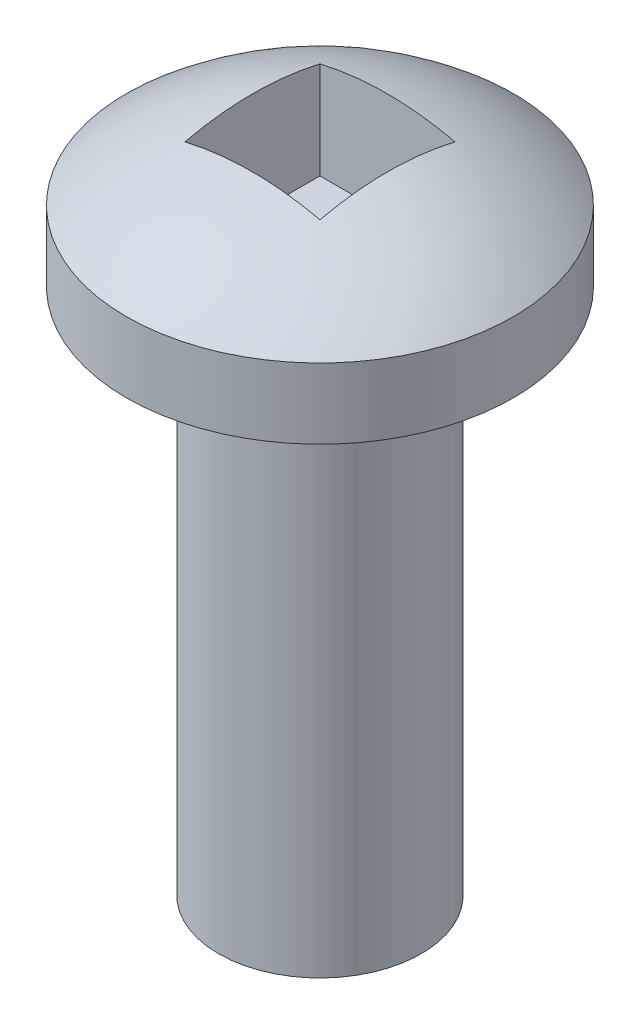
ISO-10303-21;
HEADER;
FILE_DESCRIPTION(('STEP AP214'),'2;1');
FILE_NAME('part.step','',(''),(''),'','','');
FILE_SCHEMA(('AUTOMOTIVE_DESIGN { 1 0 10303 214 1 1 1 1 }'));
ENDSEC;
DATA;
#1=APPLICATION_CONTEXT('core data for automotive mechanical design processes');
#2=APPLICATION_PROTOCOL_DEFINITION('international standard','automotive_design',2000,#1);
#3=PRODUCT_CONTEXT('',#1,'mechanical');
#4=PRODUCT('Part','Part','',(#3));
#5=PRODUCT_RELATED_PRODUCT_CATEGORY('part','',(#4));
#6=PRODUCT_DEFINITION_FORMATION('','',#4);
#7=PRODUCT_DEFINITION_CONTEXT('part definition',#1,'design');
#8=PRODUCT_DEFINITION('design','',#6,#7);
#9=PRODUCT_DEFINITION_SHAPE('','',#8);
#10=(LENGTH_UNIT() NAMED_UNIT(*) SI_UNIT(.MILLI.,.METRE.));
#11=(NAMED_UNIT(*) PLANE_ANGLE_UNIT() SI_UNIT($,.RADIAN.));
#12=(NAMED_UNIT(*) SI_UNIT($,.STERADIAN.) SOLID_ANGLE_UNIT());
#13=UNCERTAINTY_MEASURE_WITH_UNIT(LENGTH_MEASURE(1.E-05),#10,'distance_accuracy_value','');
#14=(GEOMETRIC_REPRESENTATION_CONTEXT(3) GLOBAL_UNCERTAINTY_ASSIGNED_CONTEXT((#13)) GLOBAL_UNIT_ASSIGNED_CONTEXT((#10,
#11,#12)) REPRESENTATION_CONTEXT('',''));
#15=CARTESIAN_POINT('',(0.,0.,0.));
#16=DIRECTION('',(0.,0.,1.));
#17=DIRECTION('',(1.,0.,0.));
#18=AXIS2_PLACEMENT_3D('',#15,#16,#17);
#19=CARTESIAN_POINT('',(0.,-9.525,0.));
#20=DIRECTION('',(0.,1.,0.));
#21=DIRECTION('',(0.,0.,1.));
#22=AXIS2_PLACEMENT_3D('',#19,#20,#21);
#23=CYLINDRICAL_SURFACE('',#22,1.8288);
#24=CARTESIAN_POINT('',(0.,-9.525,0.));
#25=DIRECTION('',(0.,1.,0.));
#26=DIRECTION('',(0.,0.,1.));
#27=AXIS2_PLACEMENT_3D('',#24,#25,#26);
#28=CIRCLE('',#27,1.8288);
#29=CARTESIAN_POINT('',(0.,-9.525,1.8288));
#30=VERTEX_POINT('',#29);
#31=EDGE_CURVE('E104',#30,#30,#28,.T.);
#32=CARTESIAN_POINT('',(0.,0.,0.));
#33=DIRECTION('',(0.,1.,0.));
#34=DIRECTION('',(0.,0.,1.));
#35=AXIS2_PLACEMENT_3D('',#32,#33,#34);
#36=CIRCLE('',#35,1.8288);
#37=CARTESIAN_POINT('',(0.,0.,1.8288));
#38=VERTEX_POINT('',#37);
#39=EDGE_CURVE('E108',#38,#38,#36,.T.);
#40=CARTESIAN_POINT('',(0.,-9.525,1.8288));
#41=CARTESIAN_POINT('',(0.,-9.42578125,1.8288));
#42=CARTESIAN_POINT('',(0.,-9.3265625,1.8288));
#43=CARTESIAN_POINT('',(0.,-9.128125,1.8288));
#44=CARTESIAN_POINT('',(0.,-9.02890625,1.8288));
#45=CARTESIAN_POINT('',(0.,-8.83046875,1.8288));
#46=CARTESIAN_POINT('',(0.,-8.73125,1.8288));
#47=CARTESIAN_POINT('',(0.,-8.5328125,1.8288));
#48=CARTESIAN_POINT('',(0.,-8.43359375,1.8288));
#49=CARTESIAN_POINT('',(0.,-8.23515625,1.8288));
#50=CARTESIAN_POINT('',(0.,-8.1359375,1.8288));
#51=CARTESIAN_POINT('',(0.,-7.9375,1.8288));
#52=CARTESIAN_POINT('',(0.,-7.83828125,1.8288));
#53=CARTESIAN_POINT('',(0.,-7.63984375,1.8288));
#54=CARTESIAN_POINT('',(0.,-7.540625,1.8288));
#55=CARTESIAN_POINT('',(0.,-7.3421875,1.8288));
#56=CARTESIAN_POINT('',(0.,-7.24296875,1.8288));
#57=CARTESIAN_POINT('',(0.,-7.04453125,1.8288));
#58=CARTESIAN_POINT('',(0.,-6.9453125,1.8288));
#59=CARTESIAN_POINT('',(0.,-6.746875,1.8288));
#60=CARTESIAN_POINT('',(0.,-6.64765625,1.8288));
#61=CARTESIAN_POINT('',(0.,-6.44921875,1.8288));
#62=CARTESIAN_POINT('',(0.,-6.35,1.8288));
#63=CARTESIAN_POINT('',(0.,-6.1515625,1.8288));
#64=CARTESIAN_POINT('',(0.,-6.05234375,1.8288));
#65=CARTESIAN_POINT('',(0.,-5.85390625,1.8288));
#66=CARTESIAN_POINT('',(0.,-5.7546875,1.8288));
#67=CARTESIAN_POINT('',(0.,-5.55625,1.8288));
#68=CARTESIAN_POINT('',(0.,-5.45703125,1.8288));
#69=CARTESIAN_POINT('',(0.,-5.25859375,1.8288));
#70=CARTESIAN_POINT('',(0.,-5.159375,1.8288));
#71=CARTESIAN_POINT('',(0.,-4.9609375,1.8288));
#72=CARTESIAN_POINT('',(0.,-4.86171875,1.8288));
#73=CARTESIAN_POINT('',(0.,-4.66328125,1.8288));
#74=CARTESIAN_POINT('',(0.,-4.5640625,1.8288));
#75=CARTESIAN_POINT('',(0.,-4.365625,1.8288));
#76=CARTESIAN_POINT('',(0.,-4.26640625,1.8288));
#77=CARTESIAN_POINT('',(0.,-4.06796875,1.8288));
#78=CARTESIAN_POINT('',(0.,-3.96875,1.8288));
#79=CARTESIAN_POINT('',(0.,-3.7703125,1.8288));
#80=CARTESIAN_POINT('',(0.,-3.67109375,1.8288));
#81=CARTESIAN_POINT('',(0.,-3.47265625,1.8288));
#82=CARTESIAN_POINT('',(0.,-3.3734375,1.8288));
#83=CARTESIAN_POINT('',(0.,-3.175,1.8288));
#84=CARTESIAN_POINT('',(0.,-3.07578125,1.8288));
#85=CARTESIAN_POINT('',(0.,-2.87734375,1.8288));
#86=CARTESIAN_POINT('',(0.,-2.778125,1.8288));
#87=CARTESIAN_POINT('',(0.,-2.5796875,1.8288));
#88=CARTESIAN_POINT('',(0.,-2.48046875,1.8288));
#89=CARTESIAN_POINT('',(0.,-2.28203125,1.8288));
#90=CARTESIAN_POINT('',(0.,-2.1828125,1.8288));
#91=CARTESIAN_POINT('',(0.,-1.984375,1.8288));
#92=CARTESIAN_POINT('',(0.,-1.88515625,1.8288));
#93=CARTESIAN_POINT('',(0.,-1.68671875,1.8288));
#94=CARTESIAN_POINT('',(0.,-1.5875,1.8288));
#95=CARTESIAN_POINT('',(0.,-1.3890625,1.8288));
#96=CARTESIAN_POINT('',(0.,-1.28984375,1.8288));
#97=CARTESIAN_POINT('',(0.,-1.09140625,1.8288));
#98=CARTESIAN_POINT('',(0.,-0.992187500000001,1.8288));
#99=CARTESIAN_POINT('',(0.,-0.793750000000001,1.8288));
#100=CARTESIAN_POINT('',(0.,-0.69453125,1.8288));
#101=CARTESIAN_POINT('',(0.,-0.49609375,1.8288));
#102=CARTESIAN_POINT('',(0.,-0.396875,1.8288));
#103=CARTESIAN_POINT('',(0.,-0.1984375,1.8288));
#104=CARTESIAN_POINT('',(0.,-0.0992187500000001,1.8288));
#105=CARTESIAN_POINT('',(0.,0.,1.8288));
#106=B_SPLINE_CURVE_WITH_KNOTS('',3,(#40,#41,#42,#43,#44,#45,#46,#47,#48,#49,#50,#51,#52,#53,
#54,#55,#56,#57,#58,#59,#60,#61,#62,#63,#64,#65,#66,#67,#68,#69,#70,#71,#72,#73,#74,#75,#76,#77,
#78,#79,#80,#81,#82,#83,#84,#85,#86,#87,#88,#89,#90,#91,#92,#93,#94,#95,#96,#97,#98,#99,#100,
#101,#102,#103,#104,#105),.UNSPECIFIED.,.F.,.F.,(4,2,2,2,2,2,2,2,2,2,2,2,2,2,2,2,2,2,2,2,2,2,2,
2,2,2,2,2,2,2,2,2,4),(0.,0.29765625,0.5953125,0.892968750000001,1.190625,1.48828125,1.7859375,
2.08359375,2.38125,2.67890625,2.9765625,3.27421875,3.571875,3.86953125,4.1671875,4.46484375,
4.7625,5.06015625,5.3578125,5.65546875,5.953125,6.25078125,6.5484375,6.84609375,7.14375,
7.44140625,7.7390625,8.03671875,8.334375,8.63203125,8.9296875,9.22734375,9.525),.UNSPECIFIED.);
#107=EDGE_CURVE('BSEAM32',#30,#38,#106,.T.);
#108=ORIENTED_EDGE('',*,*,#31,.T.);
#109=ORIENTED_EDGE('',*,*,#39,.F.);
#110=ORIENTED_EDGE('',*,*,#107,.T.);
#111=ORIENTED_EDGE('',*,*,#107,.F.);
#112=EDGE_LOOP('',(#108,#110,#109,#111));
#113=FACE_BOUND('',#112,.T.);
#114=ADVANCED_FACE('F32',(#113),#23,.T.);
#115=CARTESIAN_POINT('',(0.,-9.525,0.));
#116=DIRECTION('',(0.,1.,0.));
#117=DIRECTION('',(0.,0.,1.));
#118=AXIS2_PLACEMENT_3D('',#115,#116,#117);
#119=PLANE('',#118);
#120=ORIENTED_EDGE('',*,*,#31,.F.);
#121=EDGE_LOOP('',(#120));
#122=FACE_BOUND('',#121,.T.);
#123=ADVANCED_FACE('F128',(#122),#119,.F.);
#124=CARTESIAN_POINT('',(0.,1.27,0.));
#125=DIRECTION('',(0.,-1.,0.));
#126=DIRECTION('',(0.,0.,-1.));
#127=AXIS2_PLACEMENT_3D('',#124,#125,#126);
#128=CYLINDRICAL_SURFACE('',#127,3.4925);
#129=CARTESIAN_POINT('',(0.,1.27,0.));
#130=DIRECTION('',(0.,1.,0.));
#131=DIRECTION('',(0.,0.,1.));
#132=AXIS2_PLACEMENT_3D('',#129,#130,#131);
#133=CIRCLE('',#132,3.4925);
#134=CARTESIAN_POINT('',(0.,1.27,3.4925));
#135=VERTEX_POINT('',#134);
#136=EDGE_CURVE('E103',#135,#135,#133,.T.);
#137=ORIENTED_EDGE('',*,*,#136,.F.);
#138=EDGE_LOOP('',(#137));
#139=FACE_BOUND('',#138,.T.);
#140=CARTESIAN_POINT('',(0.,0.,0.));
#141=DIRECTION('',(0.,1.,0.));
#142=DIRECTION('',(0.,0.,1.));
#143=AXIS2_PLACEMENT_3D('',#140,#141,#142);
#144=CIRCLE('',#143,3.4925);
#145=CARTESIAN_POINT('',(0.,0.,3.4925));
#146=VERTEX_POINT('',#145);
#147=EDGE_CURVE('E97',#146,#146,#144,.T.);
#148=ORIENTED_EDGE('',*,*,#147,.T.);
#149=EDGE_LOOP('',(#148));
#150=FACE_BOUND('',#149,.T.);
#151=ADVANCED_FACE('F123',(#139,#150),#128,.T.);
#152=CARTESIAN_POINT('',(0.,-2.8971875,0.));
#153=DIRECTION('',(0.,0.,1.));
#154=DIRECTION('',(1.,0.,0.));
#155=AXIS2_PLACEMENT_3D('',#152,#153,#154);
#156=SPHERICAL_SURFACE('',#155,5.4371875);
#157=CARTESIAN_POINT('',(1.2192,-2.8971875,0.));
#158=DIRECTION('',(1.,0.,0.));
#159=DIRECTION('',(0.,0.,-1.));
#160=AXIS2_PLACEMENT_3D('',#157,#158,#159);
#161=CIRCLE('',#160,5.29873185490229);
#162=CARTESIAN_POINT('',(1.2192,2.25937246088053,1.2192));
#163=VERTEX_POINT('',#162);
#164=CARTESIAN_POINT('',(1.2192,2.25937246088053,-1.2192));
#165=VERTEX_POINT('',#164);
#166=EDGE_CURVE('E11',#163,#165,#161,.F.);
#167=ORIENTED_EDGE('',*,*,#166,.F.);
#168=CARTESIAN_POINT('',(0.,-2.8971875,1.2192));
#169=DIRECTION('',(0.,0.,1.));
#170=DIRECTION('',(1.,0.,0.));
#171=AXIS2_PLACEMENT_3D('',#168,#169,#170);
#172=CIRCLE('',#171,5.29873185490229);
#173=CARTESIAN_POINT('',(-1.2192,2.25937246088053,1.2192));
#174=VERTEX_POINT('',#173);
#175=EDGE_CURVE('E40',#174,#163,#172,.F.);
#176=ORIENTED_EDGE('',*,*,#175,.F.);
#177=CARTESIAN_POINT('',(-1.2192,-2.8971875,0.));
#178=DIRECTION('',(-1.,0.,0.));
#179=DIRECTION('',(0.,0.,1.));
#180=AXIS2_PLACEMENT_3D('',#177,#178,#179);
#181=CIRCLE('',#180,5.29873185490229);
#182=CARTESIAN_POINT('',(-1.2192,2.25937246088053,-1.2192));
#183=VERTEX_POINT('',#182);
#184=EDGE_CURVE('E114',#183,#174,#181,.F.);
#185=ORIENTED_EDGE('',*,*,#184,.F.);
#186=CARTESIAN_POINT('',(0.,-2.8971875,-1.2192));
#187=DIRECTION('',(0.,0.,-1.));
#188=DIRECTION('',(-1.,0.,0.));
#189=AXIS2_PLACEMENT_3D('',#186,#187,#188);
#190=CIRCLE('',#189,5.29873185490229);
#191=EDGE_CURVE('E107',#165,#183,#190,.F.);
#192=ORIENTED_EDGE('',*,*,#191,.F.);
#193=EDGE_LOOP('',(#167,#176,#185,#192));
#194=FACE_BOUND('',#193,.T.);
#195=ORIENTED_EDGE('',*,*,#136,.T.);
#196=EDGE_LOOP('',(#195));
#197=FACE_BOUND('',#196,.T.);
#198=ADVANCED_FACE('F34',(#194,#197),#156,.T.);
#199=CARTESIAN_POINT('',(0.,0.,0.));
#200=DIRECTION('',(0.,1.,0.));
#201=DIRECTION('',(0.,0.,1.));
#202=AXIS2_PLACEMENT_3D('',#199,#200,#201);
#203=PLANE('',#202);
#204=ORIENTED_EDGE('',*,*,#39,.T.);
#205=EDGE_LOOP('',(#204));
#206=FACE_BOUND('',#205,.T.);
#207=ORIENTED_EDGE('',*,*,#147,.F.);
#208=EDGE_LOOP('',(#207));
#209=FACE_BOUND('',#208,.T.);
#210=ADVANCED_FACE('F122',(#206,#209),#203,.F.);
#211=CARTESIAN_POINT('',(1.2192,0.508,1.2192));
#212=DIRECTION('',(1.,0.,0.));
#213=DIRECTION('',(0.,0.,-1.));
#214=AXIS2_PLACEMENT_3D('',#211,#212,#213);
#215=PLANE('',#214);
#216=ORIENTED_EDGE('',*,*,#166,.T.);
#217=DIRECTION('',(0.,1.,0.));
#218=VECTOR('',#217,1.);
#219=CARTESIAN_POINT('',(1.2192,0.508,-1.2192));
#220=LINE('',#219,#218);
#221=CARTESIAN_POINT('',(1.2192,0.508,-1.2192));
#222=VERTEX_POINT('',#221);
#223=EDGE_CURVE('E47',#222,#165,#220,.T.);
#224=ORIENTED_EDGE('',*,*,#223,.F.);
#225=DIRECTION('',(0.,0.,-1.));
#226=VECTOR('',#225,1.);
#227=CARTESIAN_POINT('',(1.2192,0.508,1.2192));
#228=LINE('',#227,#226);
#229=CARTESIAN_POINT('',(1.2192,0.508,1.2192));
#230=VERTEX_POINT('',#229);
#231=EDGE_CURVE('E73',#230,#222,#228,.T.);
#232=ORIENTED_EDGE('',*,*,#231,.F.);
#233=DIRECTION('',(0.,1.,0.));
#234=VECTOR('',#233,1.);
#235=CARTESIAN_POINT('',(1.2192,0.508,1.2192));
#236=LINE('',#235,#234);
#237=EDGE_CURVE('E95',#230,#163,#236,.T.);
#238=ORIENTED_EDGE('',*,*,#237,.T.);
#239=EDGE_LOOP('',(#216,#224,#232,#238));
#240=FACE_BOUND('',#239,.T.);
#241=ADVANCED_FACE('F71',(#240),#215,.F.);
#242=CARTESIAN_POINT('',(-1.2192,0.508,1.2192));
#243=DIRECTION('',(0.,0.,1.));
#244=DIRECTION('',(1.,0.,0.));
#245=AXIS2_PLACEMENT_3D('',#242,#243,#244);
#246=PLANE('',#245);
#247=ORIENTED_EDGE('',*,*,#175,.T.);
#248=ORIENTED_EDGE('',*,*,#237,.F.);
#249=DIRECTION('',(1.,0.,0.));
#250=VECTOR('',#249,1.);
#251=CARTESIAN_POINT('',(-1.2192,0.508,1.2192));
#252=LINE('',#251,#250);
#253=CARTESIAN_POINT('',(-1.2192,0.508,1.2192));
#254=VERTEX_POINT('',#253);
#255=EDGE_CURVE('E78',#254,#230,#252,.T.);
#256=ORIENTED_EDGE('',*,*,#255,.F.);
#257=DIRECTION('',(0.,1.,0.));
#258=VECTOR('',#257,1.);
#259=CARTESIAN_POINT('',(-1.2192,0.508,1.2192));
#260=LINE('',#259,#258);
#261=EDGE_CURVE('E98',#254,#174,#260,.T.);
#262=ORIENTED_EDGE('',*,*,#261,.T.);
#263=EDGE_LOOP('',(#247,#248,#256,#262));
#264=FACE_BOUND('',#263,.T.);
#265=ADVANCED_FACE('F119',(#264),#246,.F.);
#266=CARTESIAN_POINT('',(-1.2192,0.508,1.2192));
#267=DIRECTION('',(-1.,0.,0.));
#268=DIRECTION('',(0.,0.,1.));
#269=AXIS2_PLACEMENT_3D('',#266,#267,#268);
#270=PLANE('',#269);
#271=ORIENTED_EDGE('',*,*,#184,.T.);
#272=ORIENTED_EDGE('',*,*,#261,.F.);
#273=DIRECTION('',(0.,0.,1.));
#274=VECTOR('',#273,1.);
#275=CARTESIAN_POINT('',(-1.2192,0.508,1.2192));
#276=LINE('',#275,#274);
#277=CARTESIAN_POINT('',(-1.2192,0.508,-1.2192));
#278=VERTEX_POINT('',#277);
#279=EDGE_CURVE('E87',#278,#254,#276,.T.);
#280=ORIENTED_EDGE('',*,*,#279,.F.);
#281=DIRECTION('',(0.,1.,0.));
#282=VECTOR('',#281,1.);
#283=CARTESIAN_POINT('',(-1.2192,0.508,-1.2192));
#284=LINE('',#283,#282);
#285=EDGE_CURVE('E77',#278,#183,#284,.T.);
#286=ORIENTED_EDGE('',*,*,#285,.T.);
#287=EDGE_LOOP('',(#271,#272,#280,#286));
#288=FACE_BOUND('',#287,.T.);
#289=ADVANCED_FACE('F117',(#288),#270,.F.);
#290=CARTESIAN_POINT('',(-1.2192,0.508,-1.2192));
#291=DIRECTION('',(0.,0.,-1.));
#292=DIRECTION('',(-1.,0.,0.));
#293=AXIS2_PLACEMENT_3D('',#290,#291,#292);
#294=PLANE('',#293);
#295=ORIENTED_EDGE('',*,*,#191,.T.);
#296=ORIENTED_EDGE('',*,*,#285,.F.);
#297=DIRECTION('',(-1.,0.,0.));
#298=VECTOR('',#297,1.);
#299=CARTESIAN_POINT('',(-1.2192,0.508,-1.2192));
#300=LINE('',#299,#298);
#301=EDGE_CURVE('E81',#222,#278,#300,.T.);
#302=ORIENTED_EDGE('',*,*,#301,.F.);
#303=ORIENTED_EDGE('',*,*,#223,.T.);
#304=EDGE_LOOP('',(#295,#296,#302,#303));
#305=FACE_BOUND('',#304,.T.);
#306=ADVANCED_FACE('F82',(#305),#294,.F.);
#307=CARTESIAN_POINT('',(0.,0.508,0.));
#308=DIRECTION('',(0.,-1.,0.));
#309=DIRECTION('',(0.,0.,-1.));
#310=AXIS2_PLACEMENT_3D('',#307,#308,#309);
#311=PLANE('',#310);
#312=ORIENTED_EDGE('',*,*,#231,.T.);
#313=ORIENTED_EDGE('',*,*,#301,.T.);
#314=ORIENTED_EDGE('',*,*,#279,.T.);
#315=ORIENTED_EDGE('',*,*,#255,.T.);
#316=EDGE_LOOP('',(#312,#313,#314,#315));
#317=FACE_BOUND('',#316,.T.);
#318=ADVANCED_FACE('F89',(#317),#311,.F.);
#319=CLOSED_SHELL('',(#114,#123,#151,#198,#210,#241,#265,#289,#306,#318));
#320=MANIFOLD_SOLID_BREP('B2',#319);
#321=ADVANCED_BREP_SHAPE_REPRESENTATION('',(#18,#320),#14);
#322=SHAPE_DEFINITION_REPRESENTATION(#9,#321);
ENDSEC;
END-ISO-10303-21;
